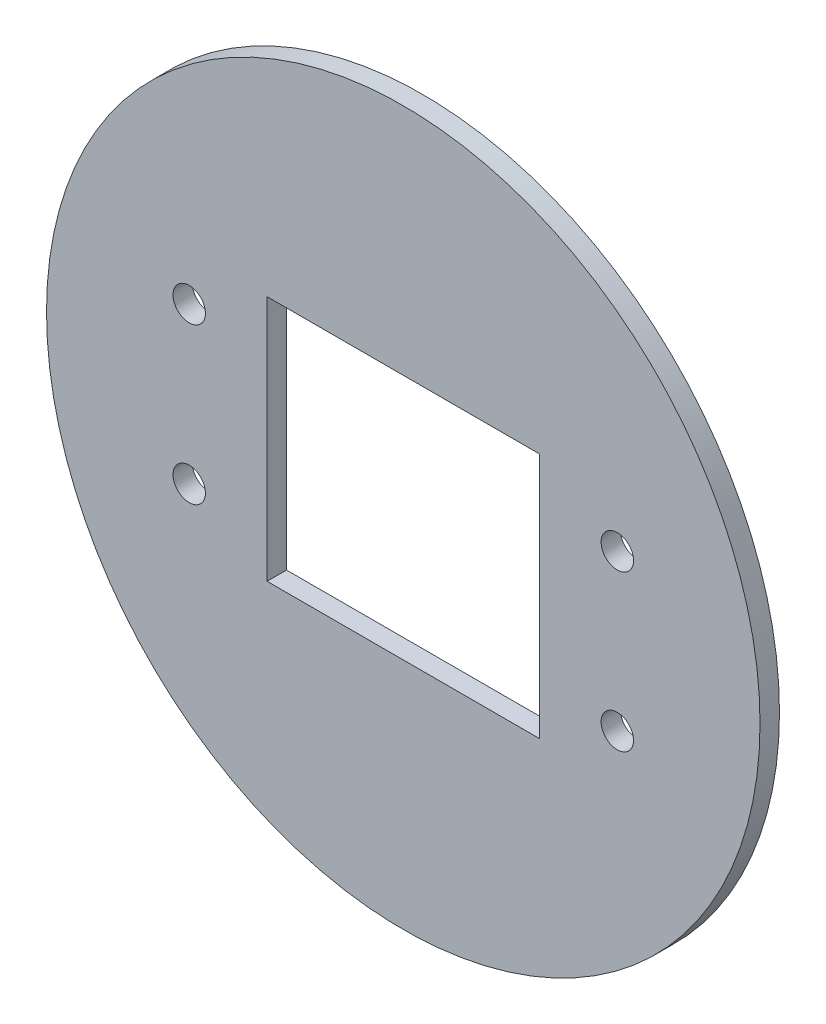
ISO-10303-21;
HEADER;
FILE_DESCRIPTION(('STEP AP214'),'2;1');
FILE_NAME('part.step','',(''),(''),'','','');
FILE_SCHEMA(('AUTOMOTIVE_DESIGN { 1 0 10303 214 1 1 1 1 }'));
ENDSEC;
DATA;
#1=APPLICATION_CONTEXT('core data for automotive mechanical design processes');
#2=APPLICATION_PROTOCOL_DEFINITION('international standard','automotive_design',2000,#1);
#3=PRODUCT_CONTEXT('',#1,'mechanical');
#4=PRODUCT('Part','Part','',(#3));
#5=PRODUCT_RELATED_PRODUCT_CATEGORY('part','',(#4));
#6=PRODUCT_DEFINITION_FORMATION('','',#4);
#7=PRODUCT_DEFINITION_CONTEXT('part definition',#1,'design');
#8=PRODUCT_DEFINITION('design','',#6,#7);
#9=PRODUCT_DEFINITION_SHAPE('','',#8);
#10=(LENGTH_UNIT() NAMED_UNIT(*) SI_UNIT(.MILLI.,.METRE.));
#11=(NAMED_UNIT(*) PLANE_ANGLE_UNIT() SI_UNIT($,.RADIAN.));
#12=(NAMED_UNIT(*) SI_UNIT($,.STERADIAN.) SOLID_ANGLE_UNIT());
#13=UNCERTAINTY_MEASURE_WITH_UNIT(LENGTH_MEASURE(1.E-05),#10,'distance_accuracy_value','');
#14=(GEOMETRIC_REPRESENTATION_CONTEXT(3) GLOBAL_UNCERTAINTY_ASSIGNED_CONTEXT((#13)) GLOBAL_UNIT_ASSIGNED_CONTEXT((#10,
#11,#12)) REPRESENTATION_CONTEXT('',''));
#15=CARTESIAN_POINT('',(0.,0.,0.));
#16=DIRECTION('',(0.,0.,1.));
#17=DIRECTION('',(1.,0.,0.));
#18=AXIS2_PLACEMENT_3D('',#15,#16,#17);
#19=CARTESIAN_POINT('',(0.,0.,1.5));
#20=DIRECTION('',(0.,0.,-1.));
#21=DIRECTION('',(-1.,0.,0.));
#22=AXIS2_PLACEMENT_3D('',#19,#20,#21);
#23=CYLINDRICAL_SURFACE('',#22,27.5);
#24=CARTESIAN_POINT('',(0.,0.,1.5));
#25=DIRECTION('',(0.,0.,1.));
#26=DIRECTION('',(1.,0.,0.));
#27=AXIS2_PLACEMENT_3D('',#24,#25,#26);
#28=CIRCLE('',#27,27.5);
#29=CARTESIAN_POINT('',(27.5,0.,1.5));
#30=VERTEX_POINT('',#29);
#31=EDGE_CURVE('E12',#30,#30,#28,.T.);
#32=ORIENTED_EDGE('',*,*,#31,.F.);
#33=EDGE_LOOP('',(#32));
#34=FACE_BOUND('',#33,.T.);
#35=CARTESIAN_POINT('',(0.,0.,0.));
#36=DIRECTION('',(0.,0.,1.));
#37=DIRECTION('',(1.,0.,0.));
#38=AXIS2_PLACEMENT_3D('',#35,#36,#37);
#39=CIRCLE('',#38,27.5);
#40=CARTESIAN_POINT('',(27.5,0.,0.));
#41=VERTEX_POINT('',#40);
#42=EDGE_CURVE('E59',#41,#41,#39,.T.);
#43=ORIENTED_EDGE('',*,*,#42,.T.);
#44=EDGE_LOOP('',(#43));
#45=FACE_BOUND('',#44,.T.);
#46=ADVANCED_FACE('F51',(#34,#45),#23,.T.);
#47=CARTESIAN_POINT('',(0.,0.,1.5));
#48=DIRECTION('',(0.,0.,1.));
#49=DIRECTION('',(1.,0.,0.));
#50=AXIS2_PLACEMENT_3D('',#47,#48,#49);
#51=PLANE('',#50);
#52=CARTESIAN_POINT('',(-16.5,6.,1.5));
#53=DIRECTION('',(0.,0.,1.));
#54=DIRECTION('',(-1.,0.,0.));
#55=AXIS2_PLACEMENT_3D('',#52,#53,#54);
#56=CIRCLE('',#55,1.25);
#57=CARTESIAN_POINT('',(-17.75,6.,1.5));
#58=VERTEX_POINT('',#57);
#59=EDGE_CURVE('E203',#58,#58,#56,.T.);
#60=ORIENTED_EDGE('',*,*,#59,.F.);
#61=EDGE_LOOP('',(#60));
#62=FACE_BOUND('',#61,.T.);
#63=CARTESIAN_POINT('',(16.5,-6.,1.5));
#64=DIRECTION('',(0.,0.,1.));
#65=DIRECTION('',(-1.,0.,0.));
#66=AXIS2_PLACEMENT_3D('',#63,#64,#65);
#67=CIRCLE('',#66,1.25);
#68=CARTESIAN_POINT('',(15.25,-6.,1.5));
#69=VERTEX_POINT('',#68);
#70=EDGE_CURVE('E204',#69,#69,#67,.T.);
#71=ORIENTED_EDGE('',*,*,#70,.F.);
#72=EDGE_LOOP('',(#71));
#73=FACE_BOUND('',#72,.T.);
#74=CARTESIAN_POINT('',(-16.5,-6.,1.5));
#75=DIRECTION('',(0.,0.,1.));
#76=DIRECTION('',(1.,0.,0.));
#77=AXIS2_PLACEMENT_3D('',#74,#75,#76);
#78=CIRCLE('',#77,1.25);
#79=CARTESIAN_POINT('',(-15.25,-6.,1.5));
#80=VERTEX_POINT('',#79);
#81=EDGE_CURVE('E208',#80,#80,#78,.T.);
#82=ORIENTED_EDGE('',*,*,#81,.F.);
#83=EDGE_LOOP('',(#82));
#84=FACE_BOUND('',#83,.T.);
#85=CARTESIAN_POINT('',(16.5,6.,1.5));
#86=DIRECTION('',(0.,0.,1.));
#87=DIRECTION('',(1.,0.,0.));
#88=AXIS2_PLACEMENT_3D('',#85,#86,#87);
#89=CIRCLE('',#88,1.25);
#90=CARTESIAN_POINT('',(17.75,6.,1.5));
#91=VERTEX_POINT('',#90);
#92=EDGE_CURVE('E115',#91,#91,#89,.T.);
#93=ORIENTED_EDGE('',*,*,#92,.F.);
#94=EDGE_LOOP('',(#93));
#95=FACE_BOUND('',#94,.T.);
#96=DIRECTION('',(1.,0.,0.));
#97=VECTOR('',#96,1.);
#98=CARTESIAN_POINT('',(-10.5,9.5,1.5));
#99=LINE('',#98,#97);
#100=CARTESIAN_POINT('',(-10.5,9.5,1.5));
#101=VERTEX_POINT('',#100);
#102=CARTESIAN_POINT('',(10.5,9.5,1.5));
#103=VERTEX_POINT('',#102);
#104=EDGE_CURVE('E95',#101,#103,#99,.T.);
#105=ORIENTED_EDGE('',*,*,#104,.T.);
#106=DIRECTION('',(0.,-1.,0.));
#107=VECTOR('',#106,1.);
#108=CARTESIAN_POINT('',(10.5,9.5,1.5));
#109=LINE('',#108,#107);
#110=CARTESIAN_POINT('',(10.5,-9.5,1.5));
#111=VERTEX_POINT('',#110);
#112=EDGE_CURVE('E101',#103,#111,#109,.T.);
#113=ORIENTED_EDGE('',*,*,#112,.T.);
#114=DIRECTION('',(1.,0.,0.));
#115=VECTOR('',#114,1.);
#116=CARTESIAN_POINT('',(-10.5,-9.5,1.5));
#117=LINE('',#116,#115);
#118=CARTESIAN_POINT('',(-10.5,-9.5,1.5));
#119=VERTEX_POINT('',#118);
#120=EDGE_CURVE('E105',#119,#111,#117,.T.);
#121=ORIENTED_EDGE('',*,*,#120,.F.);
#122=DIRECTION('',(0.,-1.,0.));
#123=VECTOR('',#122,1.);
#124=CARTESIAN_POINT('',(-10.5,9.5,1.5));
#125=LINE('',#124,#123);
#126=EDGE_CURVE('E98',#101,#119,#125,.T.);
#127=ORIENTED_EDGE('',*,*,#126,.F.);
#128=EDGE_LOOP('',(#105,#113,#121,#127));
#129=FACE_BOUND('',#128,.T.);
#130=ORIENTED_EDGE('',*,*,#31,.T.);
#131=EDGE_LOOP('',(#130));
#132=FACE_BOUND('',#131,.T.);
#133=ADVANCED_FACE('F107',(#62,#73,#84,#95,#129,#132),#51,.T.);
#134=CARTESIAN_POINT('',(0.,0.,0.));
#135=DIRECTION('',(0.,0.,1.));
#136=DIRECTION('',(1.,0.,0.));
#137=AXIS2_PLACEMENT_3D('',#134,#135,#136);
#138=PLANE('',#137);
#139=CARTESIAN_POINT('',(-16.5,6.,0.));
#140=DIRECTION('',(0.,0.,1.));
#141=DIRECTION('',(1.,0.,0.));
#142=AXIS2_PLACEMENT_3D('',#139,#140,#141);
#143=CIRCLE('',#142,1.25);
#144=CARTESIAN_POINT('',(-15.25,6.,0.));
#145=VERTEX_POINT('',#144);
#146=EDGE_CURVE('E54',#145,#145,#143,.T.);
#147=ORIENTED_EDGE('',*,*,#146,.T.);
#148=EDGE_LOOP('',(#147));
#149=FACE_BOUND('',#148,.T.);
#150=CARTESIAN_POINT('',(16.5,-6.,0.));
#151=DIRECTION('',(0.,0.,1.));
#152=DIRECTION('',(1.,0.,0.));
#153=AXIS2_PLACEMENT_3D('',#150,#151,#152);
#154=CIRCLE('',#153,1.25);
#155=CARTESIAN_POINT('',(17.75,-6.,0.));
#156=VERTEX_POINT('',#155);
#157=EDGE_CURVE('E137',#156,#156,#154,.T.);
#158=ORIENTED_EDGE('',*,*,#157,.T.);
#159=EDGE_LOOP('',(#158));
#160=FACE_BOUND('',#159,.T.);
#161=CARTESIAN_POINT('',(-16.5,-6.,0.));
#162=DIRECTION('',(0.,0.,1.));
#163=DIRECTION('',(1.,0.,0.));
#164=AXIS2_PLACEMENT_3D('',#161,#162,#163);
#165=CIRCLE('',#164,1.25);
#166=CARTESIAN_POINT('',(-15.25,-6.,0.));
#167=VERTEX_POINT('',#166);
#168=EDGE_CURVE('E135',#167,#167,#165,.T.);
#169=ORIENTED_EDGE('',*,*,#168,.T.);
#170=EDGE_LOOP('',(#169));
#171=FACE_BOUND('',#170,.T.);
#172=CARTESIAN_POINT('',(16.5,6.,0.));
#173=DIRECTION('',(0.,0.,1.));
#174=DIRECTION('',(1.,0.,0.));
#175=AXIS2_PLACEMENT_3D('',#172,#173,#174);
#176=CIRCLE('',#175,1.25);
#177=CARTESIAN_POINT('',(17.75,6.,0.));
#178=VERTEX_POINT('',#177);
#179=EDGE_CURVE('E132',#178,#178,#176,.T.);
#180=ORIENTED_EDGE('',*,*,#179,.T.);
#181=EDGE_LOOP('',(#180));
#182=FACE_BOUND('',#181,.T.);
#183=DIRECTION('',(0.,-1.,0.));
#184=VECTOR('',#183,1.);
#185=CARTESIAN_POINT('',(10.5,9.5,0.));
#186=LINE('',#185,#184);
#187=CARTESIAN_POINT('',(10.5,9.5,0.));
#188=VERTEX_POINT('',#187);
#189=CARTESIAN_POINT('',(10.5,-9.5,0.));
#190=VERTEX_POINT('',#189);
#191=EDGE_CURVE('E121',#188,#190,#186,.T.);
#192=ORIENTED_EDGE('',*,*,#191,.F.);
#193=DIRECTION('',(1.,0.,0.));
#194=VECTOR('',#193,1.);
#195=CARTESIAN_POINT('',(-10.5,9.5,0.));
#196=LINE('',#195,#194);
#197=CARTESIAN_POINT('',(-10.5,9.5,0.));
#198=VERTEX_POINT('',#197);
#199=EDGE_CURVE('E75',#198,#188,#196,.T.);
#200=ORIENTED_EDGE('',*,*,#199,.F.);
#201=DIRECTION('',(0.,-1.,0.));
#202=VECTOR('',#201,1.);
#203=CARTESIAN_POINT('',(-10.5,9.5,0.));
#204=LINE('',#203,#202);
#205=CARTESIAN_POINT('',(-10.5,-9.5,0.));
#206=VERTEX_POINT('',#205);
#207=EDGE_CURVE('E109',#198,#206,#204,.T.);
#208=ORIENTED_EDGE('',*,*,#207,.T.);
#209=DIRECTION('',(1.,0.,0.));
#210=VECTOR('',#209,1.);
#211=CARTESIAN_POINT('',(-10.5,-9.5,0.));
#212=LINE('',#211,#210);
#213=EDGE_CURVE('E112',#206,#190,#212,.T.);
#214=ORIENTED_EDGE('',*,*,#213,.T.);
#215=EDGE_LOOP('',(#192,#200,#208,#214));
#216=FACE_BOUND('',#215,.T.);
#217=ORIENTED_EDGE('',*,*,#42,.F.);
#218=EDGE_LOOP('',(#217));
#219=FACE_BOUND('',#218,.T.);
#220=ADVANCED_FACE('F144',(#149,#160,#171,#182,#216,#219),#138,.F.);
#221=CARTESIAN_POINT('',(-10.5,9.5,1.5));
#222=DIRECTION('',(0.,1.,0.));
#223=DIRECTION('',(0.,0.,1.));
#224=AXIS2_PLACEMENT_3D('',#221,#222,#223);
#225=PLANE('',#224);
#226=ORIENTED_EDGE('',*,*,#199,.T.);
#227=DIRECTION('',(0.,0.,-1.));
#228=VECTOR('',#227,1.);
#229=CARTESIAN_POINT('',(10.5,9.5,1.5));
#230=LINE('',#229,#228);
#231=EDGE_CURVE('E92',#103,#188,#230,.T.);
#232=ORIENTED_EDGE('',*,*,#231,.F.);
#233=ORIENTED_EDGE('',*,*,#104,.F.);
#234=DIRECTION('',(0.,0.,-1.));
#235=VECTOR('',#234,1.);
#236=CARTESIAN_POINT('',(-10.5,9.5,1.5));
#237=LINE('',#236,#235);
#238=EDGE_CURVE('E125',#101,#198,#237,.T.);
#239=ORIENTED_EDGE('',*,*,#238,.T.);
#240=EDGE_LOOP('',(#226,#232,#233,#239));
#241=FACE_BOUND('',#240,.T.);
#242=ADVANCED_FACE('F93',(#241),#225,.F.);
#243=CARTESIAN_POINT('',(-10.5,9.5,1.5));
#244=DIRECTION('',(1.,0.,0.));
#245=DIRECTION('',(0.,1.,0.));
#246=AXIS2_PLACEMENT_3D('',#243,#244,#245);
#247=PLANE('',#246);
#248=ORIENTED_EDGE('',*,*,#207,.F.);
#249=ORIENTED_EDGE('',*,*,#238,.F.);
#250=ORIENTED_EDGE('',*,*,#126,.T.);
#251=DIRECTION('',(0.,0.,-1.));
#252=VECTOR('',#251,1.);
#253=CARTESIAN_POINT('',(-10.5,-9.5,1.5));
#254=LINE('',#253,#252);
#255=EDGE_CURVE('E127',#119,#206,#254,.T.);
#256=ORIENTED_EDGE('',*,*,#255,.T.);
#257=EDGE_LOOP('',(#248,#249,#250,#256));
#258=FACE_BOUND('',#257,.T.);
#259=ADVANCED_FACE('F174',(#258),#247,.T.);
#260=CARTESIAN_POINT('',(-10.5,-9.5,1.5));
#261=DIRECTION('',(0.,1.,0.));
#262=DIRECTION('',(0.,0.,1.));
#263=AXIS2_PLACEMENT_3D('',#260,#261,#262);
#264=PLANE('',#263);
#265=ORIENTED_EDGE('',*,*,#213,.F.);
#266=ORIENTED_EDGE('',*,*,#255,.F.);
#267=ORIENTED_EDGE('',*,*,#120,.T.);
#268=DIRECTION('',(0.,0.,-1.));
#269=VECTOR('',#268,1.);
#270=CARTESIAN_POINT('',(10.5,-9.5,1.5));
#271=LINE('',#270,#269);
#272=EDGE_CURVE('E67',#111,#190,#271,.T.);
#273=ORIENTED_EDGE('',*,*,#272,.T.);
#274=EDGE_LOOP('',(#265,#266,#267,#273));
#275=FACE_BOUND('',#274,.T.);
#276=ADVANCED_FACE('F180',(#275),#264,.T.);
#277=CARTESIAN_POINT('',(10.5,9.5,1.5));
#278=DIRECTION('',(1.,0.,0.));
#279=DIRECTION('',(0.,1.,0.));
#280=AXIS2_PLACEMENT_3D('',#277,#278,#279);
#281=PLANE('',#280);
#282=ORIENTED_EDGE('',*,*,#191,.T.);
#283=ORIENTED_EDGE('',*,*,#272,.F.);
#284=ORIENTED_EDGE('',*,*,#112,.F.);
#285=ORIENTED_EDGE('',*,*,#231,.T.);
#286=EDGE_LOOP('',(#282,#283,#284,#285));
#287=FACE_BOUND('',#286,.T.);
#288=ADVANCED_FACE('F102',(#287),#281,.F.);
#289=CARTESIAN_POINT('',(16.5,6.,-8.5));
#290=DIRECTION('',(0.,0.,1.));
#291=DIRECTION('',(1.,0.,0.));
#292=AXIS2_PLACEMENT_3D('',#289,#290,#291);
#293=CYLINDRICAL_SURFACE('',#292,1.25);
#294=ORIENTED_EDGE('',*,*,#92,.T.);
#295=EDGE_LOOP('',(#294));
#296=FACE_BOUND('',#295,.T.);
#297=ORIENTED_EDGE('',*,*,#179,.F.);
#298=EDGE_LOOP('',(#297));
#299=FACE_BOUND('',#298,.T.);
#300=ADVANCED_FACE('F179',(#296,#299),#293,.F.);
#301=CARTESIAN_POINT('',(-16.5,-6.,-8.5));
#302=DIRECTION('',(0.,0.,1.));
#303=DIRECTION('',(1.,0.,0.));
#304=AXIS2_PLACEMENT_3D('',#301,#302,#303);
#305=CYLINDRICAL_SURFACE('',#304,1.25);
#306=ORIENTED_EDGE('',*,*,#81,.T.);
#307=EDGE_LOOP('',(#306));
#308=FACE_BOUND('',#307,.T.);
#309=ORIENTED_EDGE('',*,*,#168,.F.);
#310=EDGE_LOOP('',(#309));
#311=FACE_BOUND('',#310,.T.);
#312=ADVANCED_FACE('F154',(#308,#311),#305,.F.);
#313=CARTESIAN_POINT('',(16.5,-6.,-8.5));
#314=DIRECTION('',(0.,0.,1.));
#315=DIRECTION('',(1.,0.,0.));
#316=AXIS2_PLACEMENT_3D('',#313,#314,#315);
#317=CYLINDRICAL_SURFACE('',#316,1.25);
#318=ORIENTED_EDGE('',*,*,#70,.T.);
#319=EDGE_LOOP('',(#318));
#320=FACE_BOUND('',#319,.T.);
#321=ORIENTED_EDGE('',*,*,#157,.F.);
#322=EDGE_LOOP('',(#321));
#323=FACE_BOUND('',#322,.T.);
#324=ADVANCED_FACE('F148',(#320,#323),#317,.F.);
#325=CARTESIAN_POINT('',(-16.5,6.,-8.5));
#326=DIRECTION('',(0.,0.,1.));
#327=DIRECTION('',(1.,0.,0.));
#328=AXIS2_PLACEMENT_3D('',#325,#326,#327);
#329=CYLINDRICAL_SURFACE('',#328,1.25);
#330=ORIENTED_EDGE('',*,*,#59,.T.);
#331=EDGE_LOOP('',(#330));
#332=FACE_BOUND('',#331,.T.);
#333=ORIENTED_EDGE('',*,*,#146,.F.);
#334=EDGE_LOOP('',(#333));
#335=FACE_BOUND('',#334,.T.);
#336=ADVANCED_FACE('F146',(#332,#335),#329,.F.);
#337=CLOSED_SHELL('',(#46,#133,#220,#242,#259,#276,#288,#300,#312,#324,#336));
#338=MANIFOLD_SOLID_BREP('B2',#337);
#339=ADVANCED_BREP_SHAPE_REPRESENTATION('',(#18,#338),#14);
#340=SHAPE_DEFINITION_REPRESENTATION(#9,#339);
ENDSEC;
END-ISO-10303-21;
